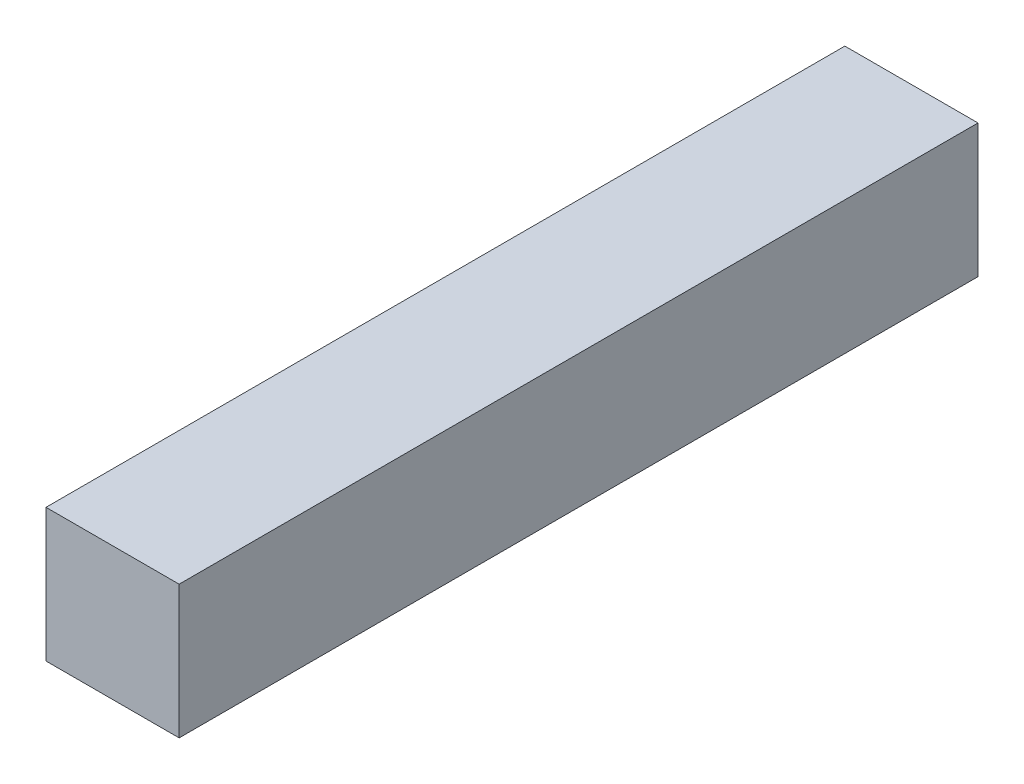
ISO-10303-21;
HEADER;
FILE_DESCRIPTION(('STEP AP214'),'2;1');
FILE_NAME('part.step','',(''),(''),'','','');
FILE_SCHEMA(('AUTOMOTIVE_DESIGN { 1 0 10303 214 1 1 1 1 }'));
ENDSEC;
DATA;
#1=APPLICATION_CONTEXT('core data for automotive mechanical design processes');
#2=APPLICATION_PROTOCOL_DEFINITION('international standard','automotive_design',2000,#1);
#3=PRODUCT_CONTEXT('',#1,'mechanical');
#4=PRODUCT('Part','Part','',(#3));
#5=PRODUCT_RELATED_PRODUCT_CATEGORY('part','',(#4));
#6=PRODUCT_DEFINITION_FORMATION('','',#4);
#7=PRODUCT_DEFINITION_CONTEXT('part definition',#1,'design');
#8=PRODUCT_DEFINITION('design','',#6,#7);
#9=PRODUCT_DEFINITION_SHAPE('','',#8);
#10=(LENGTH_UNIT() NAMED_UNIT(*) SI_UNIT(.MILLI.,.METRE.));
#11=(NAMED_UNIT(*) PLANE_ANGLE_UNIT() SI_UNIT($,.RADIAN.));
#12=(NAMED_UNIT(*) SI_UNIT($,.STERADIAN.) SOLID_ANGLE_UNIT());
#13=UNCERTAINTY_MEASURE_WITH_UNIT(LENGTH_MEASURE(1.E-05),#10,'distance_accuracy_value','');
#14=(GEOMETRIC_REPRESENTATION_CONTEXT(3) GLOBAL_UNCERTAINTY_ASSIGNED_CONTEXT((#13)) GLOBAL_UNIT_ASSIGNED_CONTEXT((#10,
#11,#12)) REPRESENTATION_CONTEXT('',''));
#15=CARTESIAN_POINT('',(0.,0.,0.));
#16=DIRECTION('',(0.,0.,1.));
#17=DIRECTION('',(1.,0.,0.));
#18=AXIS2_PLACEMENT_3D('',#15,#16,#17);
#19=CARTESIAN_POINT('',(-3.17499999999998,3.175,19.05));
#20=DIRECTION('',(1.,0.,0.));
#21=DIRECTION('',(0.,0.,-1.));
#22=AXIS2_PLACEMENT_3D('',#19,#20,#21);
#23=PLANE('',#22);
#24=DIRECTION('',(0.,0.,-1.));
#25=VECTOR('',#24,1.);
#26=CARTESIAN_POINT('',(-3.17499999999998,3.175,19.05));
#27=LINE('',#26,#25);
#28=CARTESIAN_POINT('',(-3.17499999999998,3.175,19.05));
#29=VERTEX_POINT('',#28);
#30=CARTESIAN_POINT('',(-3.17499999999998,3.175,-19.05));
#31=VERTEX_POINT('',#30);
#32=EDGE_CURVE('E90',#29,#31,#27,.T.);
#33=ORIENTED_EDGE('',*,*,#32,.T.);
#34=DIRECTION('',(0.,-1.,0.));
#35=VECTOR('',#34,1.);
#36=CARTESIAN_POINT('',(-3.17499999999998,3.175,-19.05));
#37=LINE('',#36,#35);
#38=CARTESIAN_POINT('',(-3.17499999999998,-3.175,-19.05));
#39=VERTEX_POINT('',#38);
#40=EDGE_CURVE('E85',#31,#39,#37,.T.);
#41=ORIENTED_EDGE('',*,*,#40,.T.);
#42=DIRECTION('',(0.,0.,-1.));
#43=VECTOR('',#42,1.);
#44=CARTESIAN_POINT('',(-3.17499999999998,-3.175,19.05));
#45=LINE('',#44,#43);
#46=CARTESIAN_POINT('',(-3.17499999999998,-3.175,19.05));
#47=VERTEX_POINT('',#46);
#48=EDGE_CURVE('E11',#47,#39,#45,.T.);
#49=ORIENTED_EDGE('',*,*,#48,.F.);
#50=DIRECTION('',(0.,-1.,0.));
#51=VECTOR('',#50,1.);
#52=CARTESIAN_POINT('',(-3.17499999999998,3.175,19.05));
#53=LINE('',#52,#51);
#54=EDGE_CURVE('E96',#29,#47,#53,.T.);
#55=ORIENTED_EDGE('',*,*,#54,.F.);
#56=EDGE_LOOP('',(#33,#41,#49,#55));
#57=FACE_BOUND('',#56,.T.);
#58=ADVANCED_FACE('F33',(#57),#23,.F.);
#59=CARTESIAN_POINT('',(3.17499999999998,-3.175,19.05));
#60=DIRECTION('',(0.,1.,0.));
#61=DIRECTION('',(0.,0.,1.));
#62=AXIS2_PLACEMENT_3D('',#59,#60,#61);
#63=PLANE('',#62);
#64=ORIENTED_EDGE('',*,*,#48,.T.);
#65=DIRECTION('',(1.,0.,0.));
#66=VECTOR('',#65,1.);
#67=CARTESIAN_POINT('',(3.17499999999998,-3.175,-19.05));
#68=LINE('',#67,#66);
#69=CARTESIAN_POINT('',(3.17499999999998,-3.175,-19.05));
#70=VERTEX_POINT('',#69);
#71=EDGE_CURVE('E75',#39,#70,#68,.T.);
#72=ORIENTED_EDGE('',*,*,#71,.T.);
#73=DIRECTION('',(0.,0.,-1.));
#74=VECTOR('',#73,1.);
#75=CARTESIAN_POINT('',(3.17499999999998,-3.175,19.05));
#76=LINE('',#75,#74);
#77=CARTESIAN_POINT('',(3.17499999999998,-3.175,19.05));
#78=VERTEX_POINT('',#77);
#79=EDGE_CURVE('E40',#78,#70,#76,.T.);
#80=ORIENTED_EDGE('',*,*,#79,.F.);
#81=DIRECTION('',(1.,0.,0.));
#82=VECTOR('',#81,1.);
#83=CARTESIAN_POINT('',(3.17499999999998,-3.175,19.05));
#84=LINE('',#83,#82);
#85=EDGE_CURVE('E76',#47,#78,#84,.T.);
#86=ORIENTED_EDGE('',*,*,#85,.F.);
#87=EDGE_LOOP('',(#64,#72,#80,#86));
#88=FACE_BOUND('',#87,.T.);
#89=ADVANCED_FACE('F73',(#88),#63,.F.);
#90=CARTESIAN_POINT('',(3.17499999999998,3.175,19.05));
#91=DIRECTION('',(-1.,0.,0.));
#92=DIRECTION('',(0.,0.,1.));
#93=AXIS2_PLACEMENT_3D('',#90,#91,#92);
#94=PLANE('',#93);
#95=ORIENTED_EDGE('',*,*,#79,.T.);
#96=DIRECTION('',(0.,1.,0.));
#97=VECTOR('',#96,1.);
#98=CARTESIAN_POINT('',(3.17499999999998,3.175,-19.05));
#99=LINE('',#98,#97);
#100=CARTESIAN_POINT('',(3.17499999999998,3.175,-19.05));
#101=VERTEX_POINT('',#100);
#102=EDGE_CURVE('E88',#70,#101,#99,.T.);
#103=ORIENTED_EDGE('',*,*,#102,.T.);
#104=DIRECTION('',(0.,0.,-1.));
#105=VECTOR('',#104,1.);
#106=CARTESIAN_POINT('',(3.17499999999998,3.175,19.05));
#107=LINE('',#106,#105);
#108=CARTESIAN_POINT('',(3.17499999999998,3.175,19.05));
#109=VERTEX_POINT('',#108);
#110=EDGE_CURVE('E102',#109,#101,#107,.T.);
#111=ORIENTED_EDGE('',*,*,#110,.F.);
#112=DIRECTION('',(0.,1.,0.));
#113=VECTOR('',#112,1.);
#114=CARTESIAN_POINT('',(3.17499999999998,3.175,19.05));
#115=LINE('',#114,#113);
#116=EDGE_CURVE('E52',#78,#109,#115,.T.);
#117=ORIENTED_EDGE('',*,*,#116,.F.);
#118=EDGE_LOOP('',(#95,#103,#111,#117));
#119=FACE_BOUND('',#118,.T.);
#120=ADVANCED_FACE('F104',(#119),#94,.F.);
#121=CARTESIAN_POINT('',(3.17499999999998,3.175,19.05));
#122=DIRECTION('',(0.,-1.,0.));
#123=DIRECTION('',(0.,0.,-1.));
#124=AXIS2_PLACEMENT_3D('',#121,#122,#123);
#125=PLANE('',#124);
#126=ORIENTED_EDGE('',*,*,#110,.T.);
#127=DIRECTION('',(-1.,0.,0.));
#128=VECTOR('',#127,1.);
#129=CARTESIAN_POINT('',(3.17499999999998,3.175,-19.05));
#130=LINE('',#129,#128);
#131=EDGE_CURVE('E94',#101,#31,#130,.T.);
#132=ORIENTED_EDGE('',*,*,#131,.T.);
#133=ORIENTED_EDGE('',*,*,#32,.F.);
#134=DIRECTION('',(-1.,0.,0.));
#135=VECTOR('',#134,1.);
#136=CARTESIAN_POINT('',(3.17499999999998,3.175,19.05));
#137=LINE('',#136,#135);
#138=EDGE_CURVE('E47',#109,#29,#137,.T.);
#139=ORIENTED_EDGE('',*,*,#138,.F.);
#140=EDGE_LOOP('',(#126,#132,#133,#139));
#141=FACE_BOUND('',#140,.T.);
#142=ADVANCED_FACE('F106',(#141),#125,.F.);
#143=CARTESIAN_POINT('',(0.,0.,19.05));
#144=DIRECTION('',(0.,0.,-1.));
#145=DIRECTION('',(-1.,0.,0.));
#146=AXIS2_PLACEMENT_3D('',#143,#144,#145);
#147=PLANE('',#146);
#148=ORIENTED_EDGE('',*,*,#54,.T.);
#149=ORIENTED_EDGE('',*,*,#85,.T.);
#150=ORIENTED_EDGE('',*,*,#116,.T.);
#151=ORIENTED_EDGE('',*,*,#138,.T.);
#152=EDGE_LOOP('',(#148,#149,#150,#151));
#153=FACE_BOUND('',#152,.T.);
#154=ADVANCED_FACE('F107',(#153),#147,.F.);
#155=CARTESIAN_POINT('',(0.,0.,-19.05));
#156=DIRECTION('',(0.,0.,-1.));
#157=DIRECTION('',(-1.,0.,0.));
#158=AXIS2_PLACEMENT_3D('',#155,#156,#157);
#159=PLANE('',#158);
#160=ORIENTED_EDGE('',*,*,#40,.F.);
#161=ORIENTED_EDGE('',*,*,#131,.F.);
#162=ORIENTED_EDGE('',*,*,#102,.F.);
#163=ORIENTED_EDGE('',*,*,#71,.F.);
#164=EDGE_LOOP('',(#160,#161,#162,#163));
#165=FACE_BOUND('',#164,.T.);
#166=ADVANCED_FACE('F83',(#165),#159,.T.);
#167=CLOSED_SHELL('',(#58,#89,#120,#142,#154,#166));
#168=MANIFOLD_SOLID_BREP('B2',#167);
#169=ADVANCED_BREP_SHAPE_REPRESENTATION('',(#18,#168),#14);
#170=SHAPE_DEFINITION_REPRESENTATION(#9,#169);
ENDSEC;
END-ISO-10303-21;
